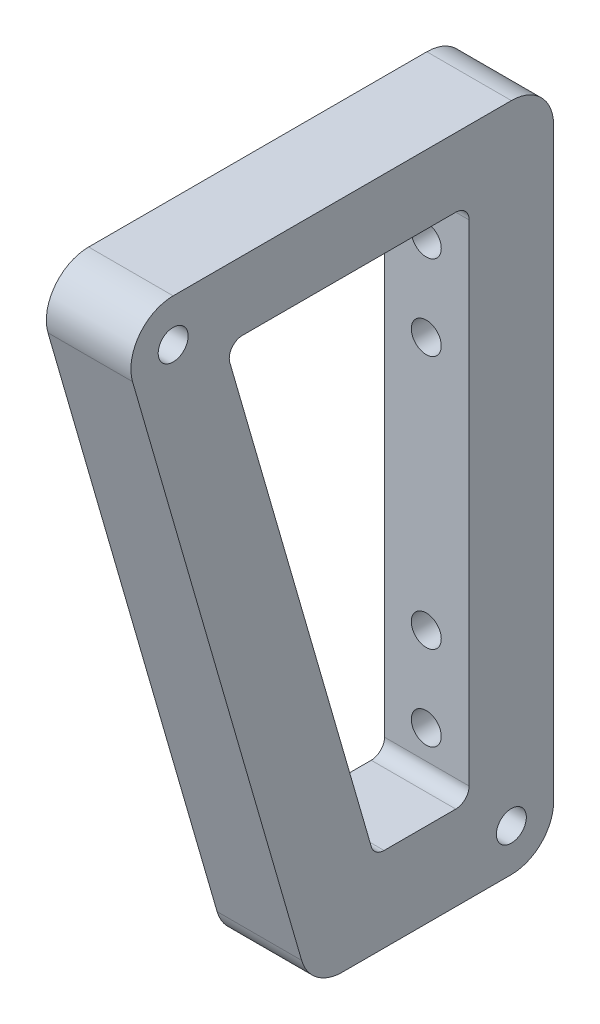
ISO-10303-21;
HEADER;
FILE_DESCRIPTION(('STEP AP214'),'2;1');
FILE_NAME('part.step','',(''),(''),'','','');
FILE_SCHEMA(('AUTOMOTIVE_DESIGN { 1 0 10303 214 1 1 1 1 }'));
ENDSEC;
DATA;
#1=APPLICATION_CONTEXT('core data for automotive mechanical design processes');
#2=APPLICATION_PROTOCOL_DEFINITION('international standard','automotive_design',2000,#1);
#3=PRODUCT_CONTEXT('',#1,'mechanical');
#4=PRODUCT('Part','Part','',(#3));
#5=PRODUCT_RELATED_PRODUCT_CATEGORY('part','',(#4));
#6=PRODUCT_DEFINITION_FORMATION('','',#4);
#7=PRODUCT_DEFINITION_CONTEXT('part definition',#1,'design');
#8=PRODUCT_DEFINITION('design','',#6,#7);
#9=PRODUCT_DEFINITION_SHAPE('','',#8);
#10=(LENGTH_UNIT() NAMED_UNIT(*) SI_UNIT(.MILLI.,.METRE.));
#11=(NAMED_UNIT(*) PLANE_ANGLE_UNIT() SI_UNIT($,.RADIAN.));
#12=(NAMED_UNIT(*) SI_UNIT($,.STERADIAN.) SOLID_ANGLE_UNIT());
#13=UNCERTAINTY_MEASURE_WITH_UNIT(LENGTH_MEASURE(1.E-05),#10,'distance_accuracy_value','');
#14=(GEOMETRIC_REPRESENTATION_CONTEXT(3) GLOBAL_UNCERTAINTY_ASSIGNED_CONTEXT((#13)) GLOBAL_UNIT_ASSIGNED_CONTEXT((#10,
#11,#12)) REPRESENTATION_CONTEXT('',''));
#15=CARTESIAN_POINT('',(0.,0.,0.));
#16=DIRECTION('',(0.,0.,1.));
#17=DIRECTION('',(1.,0.,0.));
#18=AXIS2_PLACEMENT_3D('',#15,#16,#17);
#19=CARTESIAN_POINT('',(12.7,0.,0.));
#20=DIRECTION('',(1.,0.,0.));
#21=DIRECTION('',(0.,0.,-1.));
#22=AXIS2_PLACEMENT_3D('',#19,#20,#21);
#23=PLANE('',#22);
#24=CARTESIAN_POINT('',(12.7,0.,0.));
#25=DIRECTION('',(1.,0.,0.));
#26=DIRECTION('',(0.,0.,-1.));
#27=AXIS2_PLACEMENT_3D('',#24,#25,#26);
#28=CIRCLE('',#27,2.25);
#29=CARTESIAN_POINT('',(12.7,0.,-2.25));
#30=VERTEX_POINT('',#29);
#31=EDGE_CURVE('E327',#30,#30,#28,.T.);
#32=ORIENTED_EDGE('',*,*,#31,.F.);
#33=EDGE_LOOP('',(#32));
#34=FACE_BOUND('',#33,.T.);
#35=DIRECTION('',(0.,1.,0.));
#36=VECTOR('',#35,1.);
#37=CARTESIAN_POINT('',(12.7,-6.35,-6.35));
#38=LINE('',#37,#36);
#39=CARTESIAN_POINT('',(12.7,0.,-6.35));
#40=VERTEX_POINT('',#39);
#41=CARTESIAN_POINT('',(12.7,87.9881810244993,-6.35));
#42=VERTEX_POINT('',#41);
#43=EDGE_CURVE('E338',#40,#42,#38,.T.);
#44=ORIENTED_EDGE('',*,*,#43,.T.);
#45=CARTESIAN_POINT('',(12.7,87.9881810244993,0.));
#46=DIRECTION('',(1.,0.,0.));
#47=DIRECTION('',(0.,0.,-1.));
#48=AXIS2_PLACEMENT_3D('',#45,#46,#47);
#49=CIRCLE('',#48,6.35);
#50=CARTESIAN_POINT('',(12.7,94.3381810244993,0.));
#51=VERTEX_POINT('',#50);
#52=EDGE_CURVE('E218',#42,#51,#49,.T.);
#53=ORIENTED_EDGE('',*,*,#52,.T.);
#54=DIRECTION('',(0.,0.,1.));
#55=VECTOR('',#54,1.);
#56=CARTESIAN_POINT('',(12.7,94.3381810244993,-6.35));
#57=LINE('',#56,#55);
#58=CARTESIAN_POINT('',(12.7,94.3381810244992,50.7999999999995));
#59=VERTEX_POINT('',#58);
#60=EDGE_CURVE('E174',#51,#59,#57,.T.);
#61=ORIENTED_EDGE('',*,*,#60,.T.);
#62=CARTESIAN_POINT('',(12.7,87.9881810244992,50.7999999999995));
#63=DIRECTION('',(1.,0.,0.));
#64=DIRECTION('',(0.,0.,-1.));
#65=AXIS2_PLACEMENT_3D('',#62,#63,#64);
#66=CIRCLE('',#65,6.35);
#67=CARTESIAN_POINT('',(12.7,86.2270079014842,56.9008826599733));
#68=VERTEX_POINT('',#67);
#69=EDGE_CURVE('E215',#59,#68,#66,.T.);
#70=ORIENTED_EDGE('',*,*,#69,.T.);
#71=DIRECTION('',(0.,-0.960768922830525,-0.277350098112608));
#72=VECTOR('',#71,1.);
#73=CARTESIAN_POINT('',(12.7,94.3381810244992,59.2423766529815));
#74=LINE('',#73,#72);
#75=CARTESIAN_POINT('',(12.7,-1.76117312301506,31.5008826599738));
#76=VERTEX_POINT('',#75);
#77=EDGE_CURVE('E183',#68,#76,#74,.T.);
#78=ORIENTED_EDGE('',*,*,#77,.T.);
#79=CARTESIAN_POINT('',(12.7,0.,25.4));
#80=DIRECTION('',(1.,0.,0.));
#81=DIRECTION('',(0.,0.,-1.));
#82=AXIS2_PLACEMENT_3D('',#79,#80,#81);
#83=CIRCLE('',#82,6.35);
#84=CARTESIAN_POINT('',(12.7,-6.35,25.4));
#85=VERTEX_POINT('',#84);
#86=EDGE_CURVE('E212',#76,#85,#83,.T.);
#87=ORIENTED_EDGE('',*,*,#86,.T.);
#88=DIRECTION('',(0.,0.,-1.));
#89=VECTOR('',#88,1.);
#90=CARTESIAN_POINT('',(12.7,-6.35,30.176202443628));
#91=LINE('',#90,#89);
#92=CARTESIAN_POINT('',(12.7,-6.35,0.));
#93=VERTEX_POINT('',#92);
#94=EDGE_CURVE('E189',#85,#93,#91,.T.);
#95=ORIENTED_EDGE('',*,*,#94,.T.);
#96=CARTESIAN_POINT('',(12.7,0.,0.));
#97=DIRECTION('',(1.,0.,0.));
#98=DIRECTION('',(0.,0.,-1.));
#99=AXIS2_PLACEMENT_3D('',#96,#97,#98);
#100=CIRCLE('',#99,6.35);
#101=EDGE_CURVE('E209',#93,#40,#100,.T.);
#102=ORIENTED_EDGE('',*,*,#101,.T.);
#103=EDGE_LOOP('',(#44,#53,#61,#70,#78,#87,#95,#102));
#104=FACE_BOUND('',#103,.T.);
#105=CARTESIAN_POINT('',(12.7,87.9881810244993,50.7999999999995));
#106=DIRECTION('',(1.,0.,0.));
#107=DIRECTION('',(0.,0.,-1.));
#108=AXIS2_PLACEMENT_3D('',#105,#106,#107);
#109=CIRCLE('',#108,2.25);
#110=CARTESIAN_POINT('',(12.7,87.9881810244993,48.5499999999995));
#111=VERTEX_POINT('',#110);
#112=EDGE_CURVE('E306',#111,#111,#109,.T.);
#113=ORIENTED_EDGE('',*,*,#112,.F.);
#114=EDGE_LOOP('',(#113));
#115=FACE_BOUND('',#114,.T.);
#116=DIRECTION('',(0.,0.,-1.));
#117=VECTOR('',#116,1.);
#118=CARTESIAN_POINT('',(12.7,6.35,20.623797556372));
#119=LINE('',#118,#117);
#120=CARTESIAN_POINT('',(12.7,6.35,19.1194818260955));
#121=VERTEX_POINT('',#120);
#122=CARTESIAN_POINT('',(12.7,6.35,8.35));
#123=VERTEX_POINT('',#122);
#124=EDGE_CURVE('E309',#121,#123,#119,.T.);
#125=ORIENTED_EDGE('',*,*,#124,.F.);
#126=CARTESIAN_POINT('',(12.7,8.35000000000001,19.1194818260955));
#127=DIRECTION('',(1.,0.,0.));
#128=DIRECTION('',(0.,0.,-1.));
#129=AXIS2_PLACEMENT_3D('',#126,#127,#128);
#130=CIRCLE('',#129,2.);
#131=CARTESIAN_POINT('',(12.7,7.79529980377479,21.0410196717566));
#132=VERTEX_POINT('',#131);
#133=EDGE_CURVE('E265',#121,#132,#130,.F.);
#134=ORIENTED_EDGE('',*,*,#133,.T.);
#135=DIRECTION('',(0.,-0.960768922830525,-0.277350098112609));
#136=VECTOR('',#135,1.);
#137=CARTESIAN_POINT('',(12.7,83.9881810244992,43.0360099133153));
#138=LINE('',#137,#136);
#139=CARTESIAN_POINT('',(12.7,81.433480828274,42.2985314903206));
#140=VERTEX_POINT('',#139);
#141=EDGE_CURVE('E322',#140,#132,#138,.T.);
#142=ORIENTED_EDGE('',*,*,#141,.F.);
#143=CARTESIAN_POINT('',(12.7,81.9881810244992,40.3769936446595));
#144=DIRECTION('',(1.,0.,0.));
#145=DIRECTION('',(0.,0.,-1.));
#146=AXIS2_PLACEMENT_3D('',#143,#144,#145);
#147=CIRCLE('',#146,2.);
#148=CARTESIAN_POINT('',(12.7,83.9881810244992,40.3769936446595));
#149=VERTEX_POINT('',#148);
#150=EDGE_CURVE('E11',#140,#149,#147,.F.);
#151=ORIENTED_EDGE('',*,*,#150,.T.);
#152=DIRECTION('',(0.,0.,1.));
#153=VECTOR('',#152,1.);
#154=CARTESIAN_POINT('',(12.7,83.9881810244992,6.35));
#155=LINE('',#154,#153);
#156=CARTESIAN_POINT('',(12.7,83.9881810244992,8.35));
#157=VERTEX_POINT('',#156);
#158=EDGE_CURVE('E297',#157,#149,#155,.T.);
#159=ORIENTED_EDGE('',*,*,#158,.F.);
#160=CARTESIAN_POINT('',(12.7,81.9881810244992,8.35));
#161=DIRECTION('',(1.,0.,0.));
#162=DIRECTION('',(0.,0.,-1.));
#163=AXIS2_PLACEMENT_3D('',#160,#161,#162);
#164=CIRCLE('',#163,2.);
#165=CARTESIAN_POINT('',(12.7,81.9881810244992,6.35));
#166=VERTEX_POINT('',#165);
#167=EDGE_CURVE('E277',#157,#166,#164,.F.);
#168=ORIENTED_EDGE('',*,*,#167,.T.);
#169=DIRECTION('',(0.,1.,0.));
#170=VECTOR('',#169,1.);
#171=CARTESIAN_POINT('',(12.7,6.35,6.35));
#172=LINE('',#171,#170);
#173=CARTESIAN_POINT('',(12.7,8.35,6.35));
#174=VERTEX_POINT('',#173);
#175=EDGE_CURVE('E301',#174,#166,#172,.T.);
#176=ORIENTED_EDGE('',*,*,#175,.F.);
#177=CARTESIAN_POINT('',(12.7,8.35,8.35));
#178=DIRECTION('',(1.,0.,0.));
#179=DIRECTION('',(0.,0.,-1.));
#180=AXIS2_PLACEMENT_3D('',#177,#178,#179);
#181=CIRCLE('',#180,2.);
#182=EDGE_CURVE('E271',#174,#123,#181,.F.);
#183=ORIENTED_EDGE('',*,*,#182,.T.);
#184=EDGE_LOOP('',(#125,#134,#142,#151,#159,#168,#176,#183));
#185=FACE_BOUND('',#184,.T.);
#186=ADVANCED_FACE('F39',(#34,#104,#115,#185),#23,.T.);
#187=CARTESIAN_POINT('',(0.,0.,0.));
#188=DIRECTION('',(1.,0.,0.));
#189=DIRECTION('',(0.,0.,-1.));
#190=AXIS2_PLACEMENT_3D('',#187,#188,#189);
#191=PLANE('',#190);
#192=CARTESIAN_POINT('',(0.,87.9881810244993,50.7999999999995));
#193=DIRECTION('',(1.,0.,0.));
#194=DIRECTION('',(0.,0.,-1.));
#195=AXIS2_PLACEMENT_3D('',#192,#193,#194);
#196=CIRCLE('',#195,2.25);
#197=CARTESIAN_POINT('',(0.,87.9881810244993,48.5499999999995));
#198=VERTEX_POINT('',#197);
#199=EDGE_CURVE('E300',#198,#198,#196,.T.);
#200=ORIENTED_EDGE('',*,*,#199,.T.);
#201=EDGE_LOOP('',(#200));
#202=FACE_BOUND('',#201,.T.);
#203=CARTESIAN_POINT('',(0.,0.,0.));
#204=DIRECTION('',(1.,0.,0.));
#205=DIRECTION('',(0.,0.,-1.));
#206=AXIS2_PLACEMENT_3D('',#203,#204,#205);
#207=CIRCLE('',#206,2.25);
#208=CARTESIAN_POINT('',(0.,0.,-2.25));
#209=VERTEX_POINT('',#208);
#210=EDGE_CURVE('E325',#209,#209,#207,.T.);
#211=ORIENTED_EDGE('',*,*,#210,.T.);
#212=EDGE_LOOP('',(#211));
#213=FACE_BOUND('',#212,.T.);
#214=DIRECTION('',(0.,0.,1.));
#215=VECTOR('',#214,1.);
#216=CARTESIAN_POINT('',(0.,94.3381810244993,-6.35));
#217=LINE('',#216,#215);
#218=CARTESIAN_POINT('',(0.,94.3381810244993,0.));
#219=VERTEX_POINT('',#218);
#220=CARTESIAN_POINT('',(0.,94.3381810244992,50.7999999999995));
#221=VERTEX_POINT('',#220);
#222=EDGE_CURVE('E171',#219,#221,#217,.T.);
#223=ORIENTED_EDGE('',*,*,#222,.F.);
#224=CARTESIAN_POINT('',(0.,87.9881810244993,0.));
#225=DIRECTION('',(1.,0.,0.));
#226=DIRECTION('',(0.,0.,-1.));
#227=AXIS2_PLACEMENT_3D('',#224,#225,#226);
#228=CIRCLE('',#227,6.35);
#229=CARTESIAN_POINT('',(0.,87.9881810244993,-6.35));
#230=VERTEX_POINT('',#229);
#231=EDGE_CURVE('E153',#219,#230,#228,.F.);
#232=ORIENTED_EDGE('',*,*,#231,.T.);
#233=DIRECTION('',(0.,1.,0.));
#234=VECTOR('',#233,1.);
#235=CARTESIAN_POINT('',(0.,-6.35,-6.35));
#236=LINE('',#235,#234);
#237=CARTESIAN_POINT('',(0.,0.,-6.35));
#238=VERTEX_POINT('',#237);
#239=EDGE_CURVE('E184',#238,#230,#236,.T.);
#240=ORIENTED_EDGE('',*,*,#239,.F.);
#241=CARTESIAN_POINT('',(0.,0.,0.));
#242=DIRECTION('',(1.,0.,0.));
#243=DIRECTION('',(0.,0.,-1.));
#244=AXIS2_PLACEMENT_3D('',#241,#242,#243);
#245=CIRCLE('',#244,6.35);
#246=CARTESIAN_POINT('',(0.,-6.35,0.));
#247=VERTEX_POINT('',#246);
#248=EDGE_CURVE('E176',#238,#247,#245,.F.);
#249=ORIENTED_EDGE('',*,*,#248,.T.);
#250=DIRECTION('',(0.,0.,-1.));
#251=VECTOR('',#250,1.);
#252=CARTESIAN_POINT('',(0.,-6.35,30.176202443628));
#253=LINE('',#252,#251);
#254=CARTESIAN_POINT('',(0.,-6.35,25.4));
#255=VERTEX_POINT('',#254);
#256=EDGE_CURVE('E191',#255,#247,#253,.T.);
#257=ORIENTED_EDGE('',*,*,#256,.F.);
#258=CARTESIAN_POINT('',(0.,0.,25.4));
#259=DIRECTION('',(1.,0.,0.));
#260=DIRECTION('',(0.,0.,-1.));
#261=AXIS2_PLACEMENT_3D('',#258,#259,#260);
#262=CIRCLE('',#261,6.35);
#263=CARTESIAN_POINT('',(0.,-1.76117312301506,31.5008826599738));
#264=VERTEX_POINT('',#263);
#265=EDGE_CURVE('E199',#255,#264,#262,.F.);
#266=ORIENTED_EDGE('',*,*,#265,.T.);
#267=DIRECTION('',(0.,-0.960768922830525,-0.277350098112608));
#268=VECTOR('',#267,1.);
#269=CARTESIAN_POINT('',(0.,94.3381810244992,59.2423766529815));
#270=LINE('',#269,#268);
#271=CARTESIAN_POINT('',(0.,86.2270079014842,56.9008826599733));
#272=VERTEX_POINT('',#271);
#273=EDGE_CURVE('E331',#272,#264,#270,.T.);
#274=ORIENTED_EDGE('',*,*,#273,.F.);
#275=CARTESIAN_POINT('',(0.,87.9881810244992,50.7999999999995));
#276=DIRECTION('',(1.,0.,0.));
#277=DIRECTION('',(0.,0.,-1.));
#278=AXIS2_PLACEMENT_3D('',#275,#276,#277);
#279=CIRCLE('',#278,6.35);
#280=EDGE_CURVE('E165',#272,#221,#279,.F.);
#281=ORIENTED_EDGE('',*,*,#280,.T.);
#282=EDGE_LOOP('',(#223,#232,#240,#249,#257,#266,#274,#281));
#283=FACE_BOUND('',#282,.T.);
#284=DIRECTION('',(0.,0.,1.));
#285=VECTOR('',#284,1.);
#286=CARTESIAN_POINT('',(0.,83.9881810244992,6.35));
#287=LINE('',#286,#285);
#288=CARTESIAN_POINT('',(0.,83.9881810244992,8.35));
#289=VERTEX_POINT('',#288);
#290=CARTESIAN_POINT('',(0.,83.9881810244992,40.3769936446595));
#291=VERTEX_POINT('',#290);
#292=EDGE_CURVE('E284',#289,#291,#287,.T.);
#293=ORIENTED_EDGE('',*,*,#292,.T.);
#294=CARTESIAN_POINT('',(0.,81.9881810244992,40.3769936446595));
#295=DIRECTION('',(1.,0.,0.));
#296=DIRECTION('',(0.,0.,-1.));
#297=AXIS2_PLACEMENT_3D('',#294,#295,#296);
#298=CIRCLE('',#297,2.);
#299=CARTESIAN_POINT('',(0.,81.433480828274,42.2985314903206));
#300=VERTEX_POINT('',#299);
#301=EDGE_CURVE('E48',#291,#300,#298,.T.);
#302=ORIENTED_EDGE('',*,*,#301,.T.);
#303=DIRECTION('',(0.,-0.960768922830525,-0.277350098112609));
#304=VECTOR('',#303,1.);
#305=CARTESIAN_POINT('',(0.,83.9881810244992,43.0360099133153));
#306=LINE('',#305,#304);
#307=CARTESIAN_POINT('',(0.,7.79529980377479,21.0410196717566));
#308=VERTEX_POINT('',#307);
#309=EDGE_CURVE('E283',#300,#308,#306,.T.);
#310=ORIENTED_EDGE('',*,*,#309,.T.);
#311=CARTESIAN_POINT('',(0.,8.35000000000001,19.1194818260955));
#312=DIRECTION('',(1.,0.,0.));
#313=DIRECTION('',(0.,0.,-1.));
#314=AXIS2_PLACEMENT_3D('',#311,#312,#313);
#315=CIRCLE('',#314,2.);
#316=CARTESIAN_POINT('',(0.,6.35,19.1194818260955));
#317=VERTEX_POINT('',#316);
#318=EDGE_CURVE('E262',#308,#317,#315,.T.);
#319=ORIENTED_EDGE('',*,*,#318,.T.);
#320=DIRECTION('',(0.,0.,-1.));
#321=VECTOR('',#320,1.);
#322=CARTESIAN_POINT('',(0.,6.35,20.623797556372));
#323=LINE('',#322,#321);
#324=CARTESIAN_POINT('',(0.,6.35,8.35));
#325=VERTEX_POINT('',#324);
#326=EDGE_CURVE('E293',#317,#325,#323,.T.);
#327=ORIENTED_EDGE('',*,*,#326,.T.);
#328=CARTESIAN_POINT('',(0.,8.35,8.35));
#329=DIRECTION('',(1.,0.,0.));
#330=DIRECTION('',(0.,0.,-1.));
#331=AXIS2_PLACEMENT_3D('',#328,#329,#330);
#332=CIRCLE('',#331,2.);
#333=CARTESIAN_POINT('',(0.,8.35,6.35));
#334=VERTEX_POINT('',#333);
#335=EDGE_CURVE('E268',#325,#334,#332,.T.);
#336=ORIENTED_EDGE('',*,*,#335,.T.);
#337=DIRECTION('',(0.,1.,0.));
#338=VECTOR('',#337,1.);
#339=CARTESIAN_POINT('',(0.,6.35,6.35));
#340=LINE('',#339,#338);
#341=CARTESIAN_POINT('',(0.,81.9881810244992,6.35));
#342=VERTEX_POINT('',#341);
#343=EDGE_CURVE('E316',#334,#342,#340,.T.);
#344=ORIENTED_EDGE('',*,*,#343,.T.);
#345=CARTESIAN_POINT('',(0.,81.9881810244992,8.35));
#346=DIRECTION('',(1.,0.,0.));
#347=DIRECTION('',(0.,0.,-1.));
#348=AXIS2_PLACEMENT_3D('',#345,#346,#347);
#349=CIRCLE('',#348,2.);
#350=EDGE_CURVE('E274',#342,#289,#349,.T.);
#351=ORIENTED_EDGE('',*,*,#350,.T.);
#352=EDGE_LOOP('',(#293,#302,#310,#319,#327,#336,#344,#351));
#353=FACE_BOUND('',#352,.T.);
#354=ADVANCED_FACE('F179',(#202,#213,#283,#353),#191,.F.);
#355=CARTESIAN_POINT('',(12.7,94.3381810244992,59.2423766529815));
#356=DIRECTION('',(0.,0.277350098112608,-0.960768922830525));
#357=DIRECTION('',(0.,0.960768922830525,0.277350098112608));
#358=AXIS2_PLACEMENT_3D('',#355,#356,#357);
#359=PLANE('',#358);
#360=ORIENTED_EDGE('',*,*,#77,.F.);
#361=DIRECTION('',(-1.,0.,0.));
#362=VECTOR('',#361,1.);
#363=CARTESIAN_POINT('',(12.7,86.2270079014842,56.9008826599733));
#364=LINE('',#363,#362);
#365=EDGE_CURVE('E224',#68,#272,#364,.T.);
#366=ORIENTED_EDGE('',*,*,#365,.T.);
#367=ORIENTED_EDGE('',*,*,#273,.T.);
#368=DIRECTION('',(-1.,0.,0.));
#369=VECTOR('',#368,1.);
#370=CARTESIAN_POINT('',(12.7,-1.76117312301505,31.5008826599738));
#371=LINE('',#370,#369);
#372=EDGE_CURVE('E221',#264,#76,#371,.F.);
#373=ORIENTED_EDGE('',*,*,#372,.T.);
#374=EDGE_LOOP('',(#360,#366,#367,#373));
#375=FACE_BOUND('',#374,.T.);
#376=ADVANCED_FACE('F372',(#375),#359,.F.);
#377=CARTESIAN_POINT('',(12.7,-6.35,30.176202443628));
#378=DIRECTION('',(0.,1.,0.));
#379=DIRECTION('',(0.,0.,1.));
#380=AXIS2_PLACEMENT_3D('',#377,#378,#379);
#381=PLANE('',#380);
#382=ORIENTED_EDGE('',*,*,#94,.F.);
#383=DIRECTION('',(-1.,0.,0.));
#384=VECTOR('',#383,1.);
#385=CARTESIAN_POINT('',(12.7,-6.35,25.4));
#386=LINE('',#385,#384);
#387=EDGE_CURVE('E231',#85,#255,#386,.T.);
#388=ORIENTED_EDGE('',*,*,#387,.T.);
#389=ORIENTED_EDGE('',*,*,#256,.T.);
#390=DIRECTION('',(-1.,0.,0.));
#391=VECTOR('',#390,1.);
#392=CARTESIAN_POINT('',(12.7,-6.35,0.));
#393=LINE('',#392,#391);
#394=EDGE_CURVE('E228',#247,#93,#393,.F.);
#395=ORIENTED_EDGE('',*,*,#394,.T.);
#396=EDGE_LOOP('',(#382,#388,#389,#395));
#397=FACE_BOUND('',#396,.T.);
#398=ADVANCED_FACE('F352',(#397),#381,.F.);
#399=CARTESIAN_POINT('',(12.7,-6.35,-6.35));
#400=DIRECTION('',(0.,0.,1.));
#401=DIRECTION('',(0.,-1.,0.));
#402=AXIS2_PLACEMENT_3D('',#399,#400,#401);
#403=PLANE('',#402);
#404=CARTESIAN_POINT('',(6.26993903745188,76.2,-6.35));
#405=DIRECTION('',(0.,0.,-1.));
#406=DIRECTION('',(0.,1.,0.));
#407=AXIS2_PLACEMENT_3D('',#404,#405,#406);
#408=CIRCLE('',#407,2.25);
#409=CARTESIAN_POINT('',(6.26993903745188,78.45,-6.35));
#410=VERTEX_POINT('',#409);
#411=EDGE_CURVE('E294',#410,#410,#408,.T.);
#412=ORIENTED_EDGE('',*,*,#411,.F.);
#413=EDGE_LOOP('',(#412));
#414=FACE_BOUND('',#413,.T.);
#415=CARTESIAN_POINT('',(6.26993903745188,25.4,-6.35));
#416=DIRECTION('',(0.,0.,-1.));
#417=DIRECTION('',(0.,1.,0.));
#418=AXIS2_PLACEMENT_3D('',#415,#416,#417);
#419=CIRCLE('',#418,2.25);
#420=CARTESIAN_POINT('',(6.26993903745188,27.65,-6.35));
#421=VERTEX_POINT('',#420);
#422=EDGE_CURVE('E436',#421,#421,#419,.T.);
#423=ORIENTED_EDGE('',*,*,#422,.F.);
#424=EDGE_LOOP('',(#423));
#425=FACE_BOUND('',#424,.T.);
#426=CARTESIAN_POINT('',(6.26993903745188,12.7,-6.35));
#427=DIRECTION('',(0.,0.,-1.));
#428=DIRECTION('',(0.,1.,0.));
#429=AXIS2_PLACEMENT_3D('',#426,#427,#428);
#430=CIRCLE('',#429,2.25);
#431=CARTESIAN_POINT('',(6.26993903745188,14.95,-6.35));
#432=VERTEX_POINT('',#431);
#433=EDGE_CURVE('E452',#432,#432,#430,.T.);
#434=ORIENTED_EDGE('',*,*,#433,.F.);
#435=EDGE_LOOP('',(#434));
#436=FACE_BOUND('',#435,.T.);
#437=CARTESIAN_POINT('',(6.26993903745188,63.5,-6.35));
#438=DIRECTION('',(0.,0.,-1.));
#439=DIRECTION('',(0.,1.,0.));
#440=AXIS2_PLACEMENT_3D('',#437,#438,#439);
#441=CIRCLE('',#440,2.25);
#442=CARTESIAN_POINT('',(6.26993903745188,65.75,-6.35));
#443=VERTEX_POINT('',#442);
#444=EDGE_CURVE('E433',#443,#443,#441,.T.);
#445=ORIENTED_EDGE('',*,*,#444,.F.);
#446=EDGE_LOOP('',(#445));
#447=FACE_BOUND('',#446,.T.);
#448=ORIENTED_EDGE('',*,*,#239,.T.);
#449=DIRECTION('',(-1.,0.,0.));
#450=VECTOR('',#449,1.);
#451=CARTESIAN_POINT('',(12.7,87.9881810244993,-6.35));
#452=LINE('',#451,#450);
#453=EDGE_CURVE('E158',#230,#42,#452,.F.);
#454=ORIENTED_EDGE('',*,*,#453,.T.);
#455=ORIENTED_EDGE('',*,*,#43,.F.);
#456=DIRECTION('',(-1.,0.,0.));
#457=VECTOR('',#456,1.);
#458=CARTESIAN_POINT('',(12.7,0.,-6.35));
#459=LINE('',#458,#457);
#460=EDGE_CURVE('E164',#40,#238,#459,.T.);
#461=ORIENTED_EDGE('',*,*,#460,.T.);
#462=EDGE_LOOP('',(#448,#454,#455,#461));
#463=FACE_BOUND('',#462,.T.);
#464=ADVANCED_FACE('F362',(#414,#425,#436,#447,#463),#403,.F.);
#465=CARTESIAN_POINT('',(12.7,94.3381810244993,-6.35));
#466=DIRECTION('',(0.,-1.,0.));
#467=DIRECTION('',(0.,0.,-1.));
#468=AXIS2_PLACEMENT_3D('',#465,#466,#467);
#469=PLANE('',#468);
#470=ORIENTED_EDGE('',*,*,#60,.F.);
#471=DIRECTION('',(-1.,0.,0.));
#472=VECTOR('',#471,1.);
#473=CARTESIAN_POINT('',(12.7,94.3381810244993,0.));
#474=LINE('',#473,#472);
#475=EDGE_CURVE('E157',#51,#219,#474,.T.);
#476=ORIENTED_EDGE('',*,*,#475,.T.);
#477=ORIENTED_EDGE('',*,*,#222,.T.);
#478=DIRECTION('',(-1.,0.,0.));
#479=VECTOR('',#478,1.);
#480=CARTESIAN_POINT('',(12.7,94.3381810244992,50.7999999999995));
#481=LINE('',#480,#479);
#482=EDGE_CURVE('E177',#221,#59,#481,.F.);
#483=ORIENTED_EDGE('',*,*,#482,.T.);
#484=EDGE_LOOP('',(#470,#476,#477,#483));
#485=FACE_BOUND('',#484,.T.);
#486=ADVANCED_FACE('F170',(#485),#469,.F.);
#487=CARTESIAN_POINT('',(12.7,0.,0.));
#488=DIRECTION('',(-1.,0.,0.));
#489=DIRECTION('',(0.,0.,1.));
#490=AXIS2_PLACEMENT_3D('',#487,#488,#489);
#491=CYLINDRICAL_SURFACE('',#490,2.25);
#492=ORIENTED_EDGE('',*,*,#31,.T.);
#493=EDGE_LOOP('',(#492));
#494=FACE_BOUND('',#493,.T.);
#495=ORIENTED_EDGE('',*,*,#210,.F.);
#496=EDGE_LOOP('',(#495));
#497=FACE_BOUND('',#496,.T.);
#498=ADVANCED_FACE('F370',(#494,#497),#491,.F.);
#499=CARTESIAN_POINT('',(12.7,87.9881810244993,50.7999999999995));
#500=DIRECTION('',(-1.,0.,0.));
#501=DIRECTION('',(0.,0.,1.));
#502=AXIS2_PLACEMENT_3D('',#499,#500,#501);
#503=CYLINDRICAL_SURFACE('',#502,2.25);
#504=ORIENTED_EDGE('',*,*,#112,.T.);
#505=EDGE_LOOP('',(#504));
#506=FACE_BOUND('',#505,.T.);
#507=ORIENTED_EDGE('',*,*,#199,.F.);
#508=EDGE_LOOP('',(#507));
#509=FACE_BOUND('',#508,.T.);
#510=ADVANCED_FACE('F388',(#506,#509),#503,.F.);
#511=CARTESIAN_POINT('',(12.7,83.9881810244992,43.0360099133153));
#512=DIRECTION('',(0.,0.277350098112609,-0.960768922830525));
#513=DIRECTION('',(0.,0.960768922830525,0.277350098112609));
#514=AXIS2_PLACEMENT_3D('',#511,#512,#513);
#515=PLANE('',#514);
#516=ORIENTED_EDGE('',*,*,#141,.T.);
#517=DIRECTION('',(-1.,0.,0.));
#518=VECTOR('',#517,1.);
#519=CARTESIAN_POINT('',(0.,7.79529980377479,21.0410196717566));
#520=LINE('',#519,#518);
#521=EDGE_CURVE('E238',#132,#308,#520,.T.);
#522=ORIENTED_EDGE('',*,*,#521,.T.);
#523=ORIENTED_EDGE('',*,*,#309,.F.);
#524=DIRECTION('',(-1.,0.,0.));
#525=VECTOR('',#524,1.);
#526=CARTESIAN_POINT('',(12.7,81.433480828274,42.2985314903206));
#527=LINE('',#526,#525);
#528=EDGE_CURVE('E235',#300,#140,#527,.F.);
#529=ORIENTED_EDGE('',*,*,#528,.T.);
#530=EDGE_LOOP('',(#516,#522,#523,#529));
#531=FACE_BOUND('',#530,.T.);
#532=ADVANCED_FACE('F290',(#531),#515,.T.);
#533=CARTESIAN_POINT('',(12.7,6.35,20.623797556372));
#534=DIRECTION('',(0.,1.,0.));
#535=DIRECTION('',(0.,0.,1.));
#536=AXIS2_PLACEMENT_3D('',#533,#534,#535);
#537=PLANE('',#536);
#538=ORIENTED_EDGE('',*,*,#326,.F.);
#539=DIRECTION('',(-1.,0.,0.));
#540=VECTOR('',#539,1.);
#541=CARTESIAN_POINT('',(12.7,6.35,19.1194818260955));
#542=LINE('',#541,#540);
#543=EDGE_CURVE('E246',#317,#121,#542,.F.);
#544=ORIENTED_EDGE('',*,*,#543,.T.);
#545=ORIENTED_EDGE('',*,*,#124,.T.);
#546=DIRECTION('',(-1.,0.,0.));
#547=VECTOR('',#546,1.);
#548=CARTESIAN_POINT('',(0.,6.35,8.35));
#549=LINE('',#548,#547);
#550=EDGE_CURVE('E242',#123,#325,#549,.T.);
#551=ORIENTED_EDGE('',*,*,#550,.T.);
#552=EDGE_LOOP('',(#538,#544,#545,#551));
#553=FACE_BOUND('',#552,.T.);
#554=ADVANCED_FACE('F395',(#553),#537,.T.);
#555=CARTESIAN_POINT('',(12.7,6.35,6.35));
#556=DIRECTION('',(0.,0.,1.));
#557=DIRECTION('',(1.,0.,0.));
#558=AXIS2_PLACEMENT_3D('',#555,#556,#557);
#559=PLANE('',#558);
#560=CARTESIAN_POINT('',(6.26993903745188,76.2,6.35));
#561=DIRECTION('',(0.,0.,1.));
#562=DIRECTION('',(1.,0.,0.));
#563=AXIS2_PLACEMENT_3D('',#560,#561,#562);
#564=CIRCLE('',#563,2.25);
#565=CARTESIAN_POINT('',(8.51993903745188,76.2,6.35));
#566=VERTEX_POINT('',#565);
#567=EDGE_CURVE('E428',#566,#566,#564,.F.);
#568=ORIENTED_EDGE('',*,*,#567,.T.);
#569=EDGE_LOOP('',(#568));
#570=FACE_BOUND('',#569,.T.);
#571=CARTESIAN_POINT('',(6.26993903745188,25.4,6.35));
#572=DIRECTION('',(0.,0.,1.));
#573=DIRECTION('',(1.,0.,0.));
#574=AXIS2_PLACEMENT_3D('',#571,#572,#573);
#575=CIRCLE('',#574,2.25);
#576=CARTESIAN_POINT('',(8.51993903745188,25.4,6.35));
#577=VERTEX_POINT('',#576);
#578=EDGE_CURVE('E441',#577,#577,#575,.F.);
#579=ORIENTED_EDGE('',*,*,#578,.T.);
#580=EDGE_LOOP('',(#579));
#581=FACE_BOUND('',#580,.T.);
#582=CARTESIAN_POINT('',(6.26993903745188,12.7,6.35));
#583=DIRECTION('',(0.,0.,1.));
#584=DIRECTION('',(1.,0.,0.));
#585=AXIS2_PLACEMENT_3D('',#582,#583,#584);
#586=CIRCLE('',#585,2.25);
#587=CARTESIAN_POINT('',(8.51993903745188,12.7,6.35));
#588=VERTEX_POINT('',#587);
#589=EDGE_CURVE('E440',#588,#588,#586,.F.);
#590=ORIENTED_EDGE('',*,*,#589,.T.);
#591=EDGE_LOOP('',(#590));
#592=FACE_BOUND('',#591,.T.);
#593=CARTESIAN_POINT('',(6.26993903745188,63.5,6.35));
#594=DIRECTION('',(0.,0.,1.));
#595=DIRECTION('',(1.,0.,0.));
#596=AXIS2_PLACEMENT_3D('',#593,#594,#595);
#597=CIRCLE('',#596,2.25);
#598=CARTESIAN_POINT('',(8.51993903745188,63.5,6.35));
#599=VERTEX_POINT('',#598);
#600=EDGE_CURVE('E448',#599,#599,#597,.F.);
#601=ORIENTED_EDGE('',*,*,#600,.T.);
#602=EDGE_LOOP('',(#601));
#603=FACE_BOUND('',#602,.T.);
#604=ORIENTED_EDGE('',*,*,#343,.F.);
#605=DIRECTION('',(-1.,0.,0.));
#606=VECTOR('',#605,1.);
#607=CARTESIAN_POINT('',(12.7,8.35,6.35));
#608=LINE('',#607,#606);
#609=EDGE_CURVE('E253',#334,#174,#608,.F.);
#610=ORIENTED_EDGE('',*,*,#609,.T.);
#611=ORIENTED_EDGE('',*,*,#175,.T.);
#612=DIRECTION('',(-1.,0.,0.));
#613=VECTOR('',#612,1.);
#614=CARTESIAN_POINT('',(0.,81.9881810244992,6.35));
#615=LINE('',#614,#613);
#616=EDGE_CURVE('E249',#166,#342,#615,.T.);
#617=ORIENTED_EDGE('',*,*,#616,.T.);
#618=EDGE_LOOP('',(#604,#610,#611,#617));
#619=FACE_BOUND('',#618,.T.);
#620=ADVANCED_FACE('F398',(#570,#581,#592,#603,#619),#559,.T.);
#621=CARTESIAN_POINT('',(12.7,83.9881810244992,6.35));
#622=DIRECTION('',(0.,-1.,0.));
#623=DIRECTION('',(0.,0.,-1.));
#624=AXIS2_PLACEMENT_3D('',#621,#622,#623);
#625=PLANE('',#624);
#626=ORIENTED_EDGE('',*,*,#292,.F.);
#627=DIRECTION('',(-1.,0.,0.));
#628=VECTOR('',#627,1.);
#629=CARTESIAN_POINT('',(12.7,83.9881810244992,8.35));
#630=LINE('',#629,#628);
#631=EDGE_CURVE('E60',#289,#157,#630,.F.);
#632=ORIENTED_EDGE('',*,*,#631,.T.);
#633=ORIENTED_EDGE('',*,*,#158,.T.);
#634=DIRECTION('',(-1.,0.,0.));
#635=VECTOR('',#634,1.);
#636=CARTESIAN_POINT('',(0.,83.9881810244992,40.3769936446595));
#637=LINE('',#636,#635);
#638=EDGE_CURVE('E256',#149,#291,#637,.T.);
#639=ORIENTED_EDGE('',*,*,#638,.T.);
#640=EDGE_LOOP('',(#626,#632,#633,#639));
#641=FACE_BOUND('',#640,.T.);
#642=ADVANCED_FACE('F296',(#641),#625,.T.);
#643=CARTESIAN_POINT('',(6.26993903745188,63.5,59.2433766529815));
#644=DIRECTION('',(0.,0.,-1.));
#645=DIRECTION('',(0.,1.,0.));
#646=AXIS2_PLACEMENT_3D('',#643,#644,#645);
#647=CYLINDRICAL_SURFACE('',#646,2.25);
#648=ORIENTED_EDGE('',*,*,#600,.F.);
#649=EDGE_LOOP('',(#648));
#650=FACE_BOUND('',#649,.T.);
#651=ORIENTED_EDGE('',*,*,#444,.T.);
#652=EDGE_LOOP('',(#651));
#653=FACE_BOUND('',#652,.T.);
#654=ADVANCED_FACE('F405',(#650,#653),#647,.F.);
#655=CARTESIAN_POINT('',(6.26993903745188,12.7,59.2433766529815));
#656=DIRECTION('',(0.,0.,-1.));
#657=DIRECTION('',(0.,1.,0.));
#658=AXIS2_PLACEMENT_3D('',#655,#656,#657);
#659=CYLINDRICAL_SURFACE('',#658,2.25);
#660=ORIENTED_EDGE('',*,*,#589,.F.);
#661=EDGE_LOOP('',(#660));
#662=FACE_BOUND('',#661,.T.);
#663=ORIENTED_EDGE('',*,*,#433,.T.);
#664=EDGE_LOOP('',(#663));
#665=FACE_BOUND('',#664,.T.);
#666=ADVANCED_FACE('F406',(#662,#665),#659,.F.);
#667=CARTESIAN_POINT('',(6.26993903745188,25.4,59.2433766529815));
#668=DIRECTION('',(0.,0.,-1.));
#669=DIRECTION('',(0.,1.,0.));
#670=AXIS2_PLACEMENT_3D('',#667,#668,#669);
#671=CYLINDRICAL_SURFACE('',#670,2.25);
#672=ORIENTED_EDGE('',*,*,#578,.F.);
#673=EDGE_LOOP('',(#672));
#674=FACE_BOUND('',#673,.T.);
#675=ORIENTED_EDGE('',*,*,#422,.T.);
#676=EDGE_LOOP('',(#675));
#677=FACE_BOUND('',#676,.T.);
#678=ADVANCED_FACE('F409',(#674,#677),#671,.F.);
#679=CARTESIAN_POINT('',(6.26993903745188,76.2,59.2433766529815));
#680=DIRECTION('',(0.,0.,-1.));
#681=DIRECTION('',(0.,1.,0.));
#682=AXIS2_PLACEMENT_3D('',#679,#680,#681);
#683=CYLINDRICAL_SURFACE('',#682,2.25);
#684=ORIENTED_EDGE('',*,*,#567,.F.);
#685=EDGE_LOOP('',(#684));
#686=FACE_BOUND('',#685,.T.);
#687=ORIENTED_EDGE('',*,*,#411,.T.);
#688=EDGE_LOOP('',(#687));
#689=FACE_BOUND('',#688,.T.);
#690=ADVANCED_FACE('F416',(#686,#689),#683,.F.);
#691=CARTESIAN_POINT('',(12.7,87.9881810244993,0.));
#692=DIRECTION('',(-1.,0.,0.));
#693=DIRECTION('',(0.,0.,1.));
#694=AXIS2_PLACEMENT_3D('',#691,#692,#693);
#695=CYLINDRICAL_SURFACE('',#694,6.35);
#696=ORIENTED_EDGE('',*,*,#52,.F.);
#697=ORIENTED_EDGE('',*,*,#453,.F.);
#698=ORIENTED_EDGE('',*,*,#231,.F.);
#699=ORIENTED_EDGE('',*,*,#475,.F.);
#700=EDGE_LOOP('',(#696,#697,#698,#699));
#701=FACE_BOUND('',#700,.T.);
#702=ADVANCED_FACE('F156',(#701),#695,.T.);
#703=CARTESIAN_POINT('',(12.7,87.9881810244992,50.7999999999995));
#704=DIRECTION('',(-1.,0.,0.));
#705=DIRECTION('',(0.,0.,1.));
#706=AXIS2_PLACEMENT_3D('',#703,#704,#705);
#707=CYLINDRICAL_SURFACE('',#706,6.35);
#708=ORIENTED_EDGE('',*,*,#69,.F.);
#709=ORIENTED_EDGE('',*,*,#482,.F.);
#710=ORIENTED_EDGE('',*,*,#280,.F.);
#711=ORIENTED_EDGE('',*,*,#365,.F.);
#712=EDGE_LOOP('',(#708,#709,#710,#711));
#713=FACE_BOUND('',#712,.T.);
#714=ADVANCED_FACE('F423',(#713),#707,.T.);
#715=CARTESIAN_POINT('',(12.7,0.,25.4));
#716=DIRECTION('',(-1.,0.,0.));
#717=DIRECTION('',(0.,0.,1.));
#718=AXIS2_PLACEMENT_3D('',#715,#716,#717);
#719=CYLINDRICAL_SURFACE('',#718,6.35);
#720=ORIENTED_EDGE('',*,*,#86,.F.);
#721=ORIENTED_EDGE('',*,*,#372,.F.);
#722=ORIENTED_EDGE('',*,*,#265,.F.);
#723=ORIENTED_EDGE('',*,*,#387,.F.);
#724=EDGE_LOOP('',(#720,#721,#722,#723));
#725=FACE_BOUND('',#724,.T.);
#726=ADVANCED_FACE('F490',(#725),#719,.T.);
#727=CARTESIAN_POINT('',(12.7,0.,0.));
#728=DIRECTION('',(-1.,0.,0.));
#729=DIRECTION('',(0.,0.,1.));
#730=AXIS2_PLACEMENT_3D('',#727,#728,#729);
#731=CYLINDRICAL_SURFACE('',#730,6.35);
#732=ORIENTED_EDGE('',*,*,#101,.F.);
#733=ORIENTED_EDGE('',*,*,#394,.F.);
#734=ORIENTED_EDGE('',*,*,#248,.F.);
#735=ORIENTED_EDGE('',*,*,#460,.F.);
#736=EDGE_LOOP('',(#732,#733,#734,#735));
#737=FACE_BOUND('',#736,.T.);
#738=ADVANCED_FACE('F356',(#737),#731,.T.);
#739=CARTESIAN_POINT('',(12.7,8.35000000000001,19.1194818260955));
#740=DIRECTION('',(1.,0.,0.));
#741=DIRECTION('',(0.,0.,-1.));
#742=AXIS2_PLACEMENT_3D('',#739,#740,#741);
#743=CYLINDRICAL_SURFACE('',#742,2.);
#744=ORIENTED_EDGE('',*,*,#133,.F.);
#745=ORIENTED_EDGE('',*,*,#543,.F.);
#746=ORIENTED_EDGE('',*,*,#318,.F.);
#747=ORIENTED_EDGE('',*,*,#521,.F.);
#748=EDGE_LOOP('',(#744,#745,#746,#747));
#749=FACE_BOUND('',#748,.T.);
#750=ADVANCED_FACE('F482',(#749),#743,.F.);
#751=CARTESIAN_POINT('',(12.7,8.35,8.35));
#752=DIRECTION('',(1.,0.,0.));
#753=DIRECTION('',(0.,0.,-1.));
#754=AXIS2_PLACEMENT_3D('',#751,#752,#753);
#755=CYLINDRICAL_SURFACE('',#754,2.);
#756=ORIENTED_EDGE('',*,*,#182,.F.);
#757=ORIENTED_EDGE('',*,*,#609,.F.);
#758=ORIENTED_EDGE('',*,*,#335,.F.);
#759=ORIENTED_EDGE('',*,*,#550,.F.);
#760=EDGE_LOOP('',(#756,#757,#758,#759));
#761=FACE_BOUND('',#760,.T.);
#762=ADVANCED_FACE('F469',(#761),#755,.F.);
#763=CARTESIAN_POINT('',(12.7,81.9881810244992,8.35));
#764=DIRECTION('',(1.,0.,0.));
#765=DIRECTION('',(0.,0.,-1.));
#766=AXIS2_PLACEMENT_3D('',#763,#764,#765);
#767=CYLINDRICAL_SURFACE('',#766,2.);
#768=ORIENTED_EDGE('',*,*,#167,.F.);
#769=ORIENTED_EDGE('',*,*,#631,.F.);
#770=ORIENTED_EDGE('',*,*,#350,.F.);
#771=ORIENTED_EDGE('',*,*,#616,.F.);
#772=EDGE_LOOP('',(#768,#769,#770,#771));
#773=FACE_BOUND('',#772,.T.);
#774=ADVANCED_FACE('F476',(#773),#767,.F.);
#775=CARTESIAN_POINT('',(12.7,81.9881810244992,40.3769936446595));
#776=DIRECTION('',(1.,0.,0.));
#777=DIRECTION('',(0.,0.,-1.));
#778=AXIS2_PLACEMENT_3D('',#775,#776,#777);
#779=CYLINDRICAL_SURFACE('',#778,2.);
#780=ORIENTED_EDGE('',*,*,#150,.F.);
#781=ORIENTED_EDGE('',*,*,#528,.F.);
#782=ORIENTED_EDGE('',*,*,#301,.F.);
#783=ORIENTED_EDGE('',*,*,#638,.F.);
#784=EDGE_LOOP('',(#780,#781,#782,#783));
#785=FACE_BOUND('',#784,.T.);
#786=ADVANCED_FACE('F41',(#785),#779,.F.);
#787=CLOSED_SHELL('',(#186,#354,#376,#398,#464,#486,#498,#510,#532,#554,#620,#642,#654,#666,
#678,#690,#702,#714,#726,#738,#750,#762,#774,#786));
#788=MANIFOLD_SOLID_BREP('B2',#787);
#789=ADVANCED_BREP_SHAPE_REPRESENTATION('',(#18,#788),#14);
#790=SHAPE_DEFINITION_REPRESENTATION(#9,#789);
ENDSEC;
END-ISO-10303-21;
